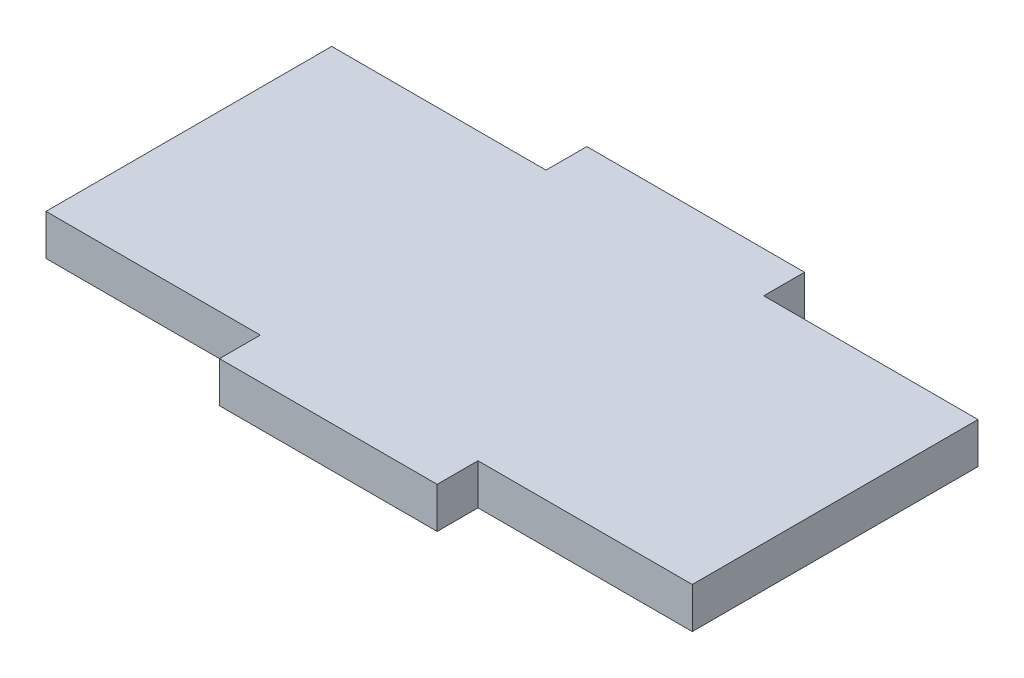
ISO-10303-21;
HEADER;
FILE_DESCRIPTION(('STEP AP214'),'2;1');
FILE_NAME('part.step','',(''),(''),'','','');
FILE_SCHEMA(('AUTOMOTIVE_DESIGN { 1 0 10303 214 1 1 1 1 }'));
ENDSEC;
DATA;
#1=APPLICATION_CONTEXT('core data for automotive mechanical design processes');
#2=APPLICATION_PROTOCOL_DEFINITION('international standard','automotive_design',2000,#1);
#3=PRODUCT_CONTEXT('',#1,'mechanical');
#4=PRODUCT('Part','Part','',(#3));
#5=PRODUCT_RELATED_PRODUCT_CATEGORY('part','',(#4));
#6=PRODUCT_DEFINITION_FORMATION('','',#4);
#7=PRODUCT_DEFINITION_CONTEXT('part definition',#1,'design');
#8=PRODUCT_DEFINITION('design','',#6,#7);
#9=PRODUCT_DEFINITION_SHAPE('','',#8);
#10=(LENGTH_UNIT() NAMED_UNIT(*) SI_UNIT(.MILLI.,.METRE.));
#11=(NAMED_UNIT(*) PLANE_ANGLE_UNIT() SI_UNIT($,.RADIAN.));
#12=(NAMED_UNIT(*) SI_UNIT($,.STERADIAN.) SOLID_ANGLE_UNIT());
#13=UNCERTAINTY_MEASURE_WITH_UNIT(LENGTH_MEASURE(1.E-05),#10,'distance_accuracy_value','');
#14=(GEOMETRIC_REPRESENTATION_CONTEXT(3) GLOBAL_UNCERTAINTY_ASSIGNED_CONTEXT((#13)) GLOBAL_UNIT_ASSIGNED_CONTEXT((#10,
#11,#12)) REPRESENTATION_CONTEXT('',''));
#15=CARTESIAN_POINT('',(0.,0.,0.));
#16=DIRECTION('',(0.,0.,1.));
#17=DIRECTION('',(1.,0.,0.));
#18=AXIS2_PLACEMENT_3D('',#15,#16,#17);
#19=CARTESIAN_POINT('',(-31.75,3.,0.));
#20=DIRECTION('',(-1.,0.,0.));
#21=DIRECTION('',(0.,0.,1.));
#22=AXIS2_PLACEMENT_3D('',#19,#20,#21);
#23=PLANE('',#22);
#24=DIRECTION('',(0.,0.,-1.));
#25=VECTOR('',#24,1.);
#26=CARTESIAN_POINT('',(-31.75,0.,0.));
#27=LINE('',#26,#25);
#28=CARTESIAN_POINT('',(-31.75,0.,0.));
#29=VERTEX_POINT('',#28);
#30=CARTESIAN_POINT('',(-31.75,0.,-3.));
#31=VERTEX_POINT('',#30);
#32=EDGE_CURVE('E155',#29,#31,#27,.T.);
#33=ORIENTED_EDGE('',*,*,#32,.F.);
#34=DIRECTION('',(0.,-1.,0.));
#35=VECTOR('',#34,1.);
#36=CARTESIAN_POINT('',(-31.75,3.,0.));
#37=LINE('',#36,#35);
#38=CARTESIAN_POINT('',(-31.75,3.,0.));
#39=VERTEX_POINT('',#38);
#40=EDGE_CURVE('E11',#39,#29,#37,.T.);
#41=ORIENTED_EDGE('',*,*,#40,.F.);
#42=DIRECTION('',(0.,0.,-1.));
#43=VECTOR('',#42,1.);
#44=CARTESIAN_POINT('',(-31.75,3.,0.));
#45=LINE('',#44,#43);
#46=CARTESIAN_POINT('',(-31.75,3.,-3.));
#47=VERTEX_POINT('',#46);
#48=EDGE_CURVE('E182',#39,#47,#45,.T.);
#49=ORIENTED_EDGE('',*,*,#48,.T.);
#50=DIRECTION('',(0.,-1.,0.));
#51=VECTOR('',#50,1.);
#52=CARTESIAN_POINT('',(-31.75,3.,-3.));
#53=LINE('',#52,#51);
#54=EDGE_CURVE('E53',#47,#31,#53,.T.);
#55=ORIENTED_EDGE('',*,*,#54,.T.);
#56=EDGE_LOOP('',(#33,#41,#49,#55));
#57=FACE_BOUND('',#56,.T.);
#58=ADVANCED_FACE('F37',(#57),#23,.T.);
#59=CARTESIAN_POINT('',(0.,3.,0.));
#60=DIRECTION('',(0.,0.,-1.));
#61=DIRECTION('',(-1.,0.,0.));
#62=AXIS2_PLACEMENT_3D('',#59,#60,#61);
#63=PLANE('',#62);
#64=DIRECTION('',(1.,0.,0.));
#65=VECTOR('',#64,1.);
#66=CARTESIAN_POINT('',(0.,0.,0.));
#67=LINE('',#66,#65);
#68=CARTESIAN_POINT('',(-15.75,0.,0.));
#69=VERTEX_POINT('',#68);
#70=EDGE_CURVE('E157',#29,#69,#67,.T.);
#71=ORIENTED_EDGE('',*,*,#70,.T.);
#72=DIRECTION('',(0.,-1.,0.));
#73=VECTOR('',#72,1.);
#74=CARTESIAN_POINT('',(-15.75,3.,0.));
#75=LINE('',#74,#73);
#76=CARTESIAN_POINT('',(-15.75,3.,0.));
#77=VERTEX_POINT('',#76);
#78=EDGE_CURVE('E45',#77,#69,#75,.T.);
#79=ORIENTED_EDGE('',*,*,#78,.F.);
#80=DIRECTION('',(1.,0.,0.));
#81=VECTOR('',#80,1.);
#82=CARTESIAN_POINT('',(0.,3.,0.));
#83=LINE('',#82,#81);
#84=EDGE_CURVE('E369',#39,#77,#83,.T.);
#85=ORIENTED_EDGE('',*,*,#84,.F.);
#86=ORIENTED_EDGE('',*,*,#40,.T.);
#87=EDGE_LOOP('',(#71,#79,#85,#86));
#88=FACE_BOUND('',#87,.T.);
#89=ADVANCED_FACE('F256',(#88),#63,.F.);
#90=CARTESIAN_POINT('',(-15.75,3.,0.));
#91=DIRECTION('',(-1.,0.,0.));
#92=DIRECTION('',(0.,0.,1.));
#93=AXIS2_PLACEMENT_3D('',#90,#91,#92);
#94=PLANE('',#93);
#95=DIRECTION('',(0.,0.,-1.));
#96=VECTOR('',#95,1.);
#97=CARTESIAN_POINT('',(-15.75,0.,0.));
#98=LINE('',#97,#96);
#99=CARTESIAN_POINT('',(-15.75,0.,-3.));
#100=VERTEX_POINT('',#99);
#101=EDGE_CURVE('E159',#69,#100,#98,.T.);
#102=ORIENTED_EDGE('',*,*,#101,.T.);
#103=DIRECTION('',(0.,-1.,0.));
#104=VECTOR('',#103,1.);
#105=CARTESIAN_POINT('',(-15.75,3.,-3.));
#106=LINE('',#105,#104);
#107=CARTESIAN_POINT('',(-15.75,3.,-3.));
#108=VERTEX_POINT('',#107);
#109=EDGE_CURVE('E198',#108,#100,#106,.T.);
#110=ORIENTED_EDGE('',*,*,#109,.F.);
#111=DIRECTION('',(0.,0.,-1.));
#112=VECTOR('',#111,1.);
#113=CARTESIAN_POINT('',(-15.75,3.,0.));
#114=LINE('',#113,#112);
#115=EDGE_CURVE('E207',#77,#108,#114,.T.);
#116=ORIENTED_EDGE('',*,*,#115,.F.);
#117=ORIENTED_EDGE('',*,*,#78,.T.);
#118=EDGE_LOOP('',(#102,#110,#116,#117));
#119=FACE_BOUND('',#118,.T.);
#120=ADVANCED_FACE('F205',(#119),#94,.F.);
#121=CARTESIAN_POINT('',(0.,3.,-3.));
#122=DIRECTION('',(0.,0.,-1.));
#123=DIRECTION('',(-1.,0.,0.));
#124=AXIS2_PLACEMENT_3D('',#121,#122,#123);
#125=PLANE('',#124);
#126=DIRECTION('',(1.,0.,0.));
#127=VECTOR('',#126,1.);
#128=CARTESIAN_POINT('',(0.,0.,-3.));
#129=LINE('',#128,#127);
#130=CARTESIAN_POINT('',(0.,0.,-3.));
#131=VERTEX_POINT('',#130);
#132=EDGE_CURVE('E161',#100,#131,#129,.T.);
#133=ORIENTED_EDGE('',*,*,#132,.T.);
#134=DIRECTION('',(0.,-1.,0.));
#135=VECTOR('',#134,1.);
#136=CARTESIAN_POINT('',(0.,3.,-3.));
#137=LINE('',#136,#135);
#138=CARTESIAN_POINT('',(0.,3.,-3.));
#139=VERTEX_POINT('',#138);
#140=EDGE_CURVE('E195',#139,#131,#137,.T.);
#141=ORIENTED_EDGE('',*,*,#140,.F.);
#142=DIRECTION('',(1.,0.,0.));
#143=VECTOR('',#142,1.);
#144=CARTESIAN_POINT('',(0.,3.,-3.));
#145=LINE('',#144,#143);
#146=EDGE_CURVE('E226',#108,#139,#145,.T.);
#147=ORIENTED_EDGE('',*,*,#146,.F.);
#148=ORIENTED_EDGE('',*,*,#109,.T.);
#149=EDGE_LOOP('',(#133,#141,#147,#148));
#150=FACE_BOUND('',#149,.T.);
#151=ADVANCED_FACE('F216',(#150),#125,.F.);
#152=CARTESIAN_POINT('',(0.,3.,0.));
#153=DIRECTION('',(-1.,0.,0.));
#154=DIRECTION('',(0.,0.,1.));
#155=AXIS2_PLACEMENT_3D('',#152,#153,#154);
#156=PLANE('',#155);
#157=DIRECTION('',(0.,0.,-1.));
#158=VECTOR('',#157,1.);
#159=CARTESIAN_POINT('',(0.,0.,0.));
#160=LINE('',#159,#158);
#161=CARTESIAN_POINT('',(0.,0.,-24.));
#162=VERTEX_POINT('',#161);
#163=EDGE_CURVE('E163',#131,#162,#160,.T.);
#164=ORIENTED_EDGE('',*,*,#163,.T.);
#165=DIRECTION('',(0.,-1.,0.));
#166=VECTOR('',#165,1.);
#167=CARTESIAN_POINT('',(0.,3.,-24.));
#168=LINE('',#167,#166);
#169=CARTESIAN_POINT('',(0.,3.,-24.));
#170=VERTEX_POINT('',#169);
#171=EDGE_CURVE('E193',#170,#162,#168,.T.);
#172=ORIENTED_EDGE('',*,*,#171,.F.);
#173=DIRECTION('',(0.,0.,-1.));
#174=VECTOR('',#173,1.);
#175=CARTESIAN_POINT('',(0.,3.,0.));
#176=LINE('',#175,#174);
#177=EDGE_CURVE('E222',#139,#170,#176,.T.);
#178=ORIENTED_EDGE('',*,*,#177,.F.);
#179=ORIENTED_EDGE('',*,*,#140,.T.);
#180=EDGE_LOOP('',(#164,#172,#178,#179));
#181=FACE_BOUND('',#180,.T.);
#182=ADVANCED_FACE('F220',(#181),#156,.F.);
#183=CARTESIAN_POINT('',(0.,3.,-24.));
#184=DIRECTION('',(0.,0.,-1.));
#185=DIRECTION('',(-1.,0.,0.));
#186=AXIS2_PLACEMENT_3D('',#183,#184,#185);
#187=PLANE('',#186);
#188=DIRECTION('',(1.,0.,0.));
#189=VECTOR('',#188,1.);
#190=CARTESIAN_POINT('',(0.,0.,-24.));
#191=LINE('',#190,#189);
#192=CARTESIAN_POINT('',(-15.75,0.,-24.));
#193=VERTEX_POINT('',#192);
#194=EDGE_CURVE('E166',#193,#162,#191,.T.);
#195=ORIENTED_EDGE('',*,*,#194,.F.);
#196=DIRECTION('',(0.,-1.,0.));
#197=VECTOR('',#196,1.);
#198=CARTESIAN_POINT('',(-15.75,3.,-24.));
#199=LINE('',#198,#197);
#200=CARTESIAN_POINT('',(-15.75,3.,-24.));
#201=VERTEX_POINT('',#200);
#202=EDGE_CURVE('E191',#201,#193,#199,.T.);
#203=ORIENTED_EDGE('',*,*,#202,.F.);
#204=DIRECTION('',(1.,0.,0.));
#205=VECTOR('',#204,1.);
#206=CARTESIAN_POINT('',(0.,3.,-24.));
#207=LINE('',#206,#205);
#208=EDGE_CURVE('E225',#201,#170,#207,.T.);
#209=ORIENTED_EDGE('',*,*,#208,.T.);
#210=ORIENTED_EDGE('',*,*,#171,.T.);
#211=EDGE_LOOP('',(#195,#203,#209,#210));
#212=FACE_BOUND('',#211,.T.);
#213=ADVANCED_FACE('F269',(#212),#187,.T.);
#214=CARTESIAN_POINT('',(-15.75,3.,0.));
#215=DIRECTION('',(1.,0.,0.));
#216=DIRECTION('',(0.,0.,-1.));
#217=AXIS2_PLACEMENT_3D('',#214,#215,#216);
#218=PLANE('',#217);
#219=DIRECTION('',(0.,0.,1.));
#220=VECTOR('',#219,1.);
#221=CARTESIAN_POINT('',(-15.75,0.,0.));
#222=LINE('',#221,#220);
#223=CARTESIAN_POINT('',(-15.75,0.,-27.));
#224=VERTEX_POINT('',#223);
#225=EDGE_CURVE('E169',#224,#193,#222,.T.);
#226=ORIENTED_EDGE('',*,*,#225,.F.);
#227=DIRECTION('',(0.,-1.,0.));
#228=VECTOR('',#227,1.);
#229=CARTESIAN_POINT('',(-15.75,3.,-27.));
#230=LINE('',#229,#228);
#231=CARTESIAN_POINT('',(-15.75,3.,-27.));
#232=VERTEX_POINT('',#231);
#233=EDGE_CURVE('E189',#232,#224,#230,.T.);
#234=ORIENTED_EDGE('',*,*,#233,.F.);
#235=DIRECTION('',(0.,0.,1.));
#236=VECTOR('',#235,1.);
#237=CARTESIAN_POINT('',(-15.75,3.,0.));
#238=LINE('',#237,#236);
#239=EDGE_CURVE('E228',#232,#201,#238,.T.);
#240=ORIENTED_EDGE('',*,*,#239,.T.);
#241=ORIENTED_EDGE('',*,*,#202,.T.);
#242=EDGE_LOOP('',(#226,#234,#240,#241));
#243=FACE_BOUND('',#242,.T.);
#244=ADVANCED_FACE('F272',(#243),#218,.T.);
#245=CARTESIAN_POINT('',(0.,3.,-27.));
#246=DIRECTION('',(0.,0.,1.));
#247=DIRECTION('',(1.,0.,0.));
#248=AXIS2_PLACEMENT_3D('',#245,#246,#247);
#249=PLANE('',#248);
#250=DIRECTION('',(-1.,0.,0.));
#251=VECTOR('',#250,1.);
#252=CARTESIAN_POINT('',(0.,0.,-27.));
#253=LINE('',#252,#251);
#254=CARTESIAN_POINT('',(-31.75,0.,-27.));
#255=VERTEX_POINT('',#254);
#256=EDGE_CURVE('E172',#224,#255,#253,.T.);
#257=ORIENTED_EDGE('',*,*,#256,.T.);
#258=DIRECTION('',(0.,-1.,0.));
#259=VECTOR('',#258,1.);
#260=CARTESIAN_POINT('',(-31.75,3.,-27.));
#261=LINE('',#260,#259);
#262=CARTESIAN_POINT('',(-31.75,3.,-27.));
#263=VERTEX_POINT('',#262);
#264=EDGE_CURVE('E186',#263,#255,#261,.T.);
#265=ORIENTED_EDGE('',*,*,#264,.F.);
#266=DIRECTION('',(-1.,0.,0.));
#267=VECTOR('',#266,1.);
#268=CARTESIAN_POINT('',(0.,3.,-27.));
#269=LINE('',#268,#267);
#270=EDGE_CURVE('E235',#232,#263,#269,.T.);
#271=ORIENTED_EDGE('',*,*,#270,.F.);
#272=ORIENTED_EDGE('',*,*,#233,.T.);
#273=EDGE_LOOP('',(#257,#265,#271,#272));
#274=FACE_BOUND('',#273,.T.);
#275=ADVANCED_FACE('F240',(#274),#249,.F.);
#276=CARTESIAN_POINT('',(-31.75,3.,0.));
#277=DIRECTION('',(1.,0.,0.));
#278=DIRECTION('',(0.,0.,-1.));
#279=AXIS2_PLACEMENT_3D('',#276,#277,#278);
#280=PLANE('',#279);
#281=DIRECTION('',(0.,0.,1.));
#282=VECTOR('',#281,1.);
#283=CARTESIAN_POINT('',(-31.75,0.,0.));
#284=LINE('',#283,#282);
#285=CARTESIAN_POINT('',(-31.75,0.,-24.));
#286=VERTEX_POINT('',#285);
#287=EDGE_CURVE('E174',#255,#286,#284,.T.);
#288=ORIENTED_EDGE('',*,*,#287,.T.);
#289=DIRECTION('',(0.,-1.,0.));
#290=VECTOR('',#289,1.);
#291=CARTESIAN_POINT('',(-31.75,3.,-24.));
#292=LINE('',#291,#290);
#293=CARTESIAN_POINT('',(-31.75,3.,-24.));
#294=VERTEX_POINT('',#293);
#295=EDGE_CURVE('E147',#294,#286,#292,.T.);
#296=ORIENTED_EDGE('',*,*,#295,.F.);
#297=DIRECTION('',(0.,0.,1.));
#298=VECTOR('',#297,1.);
#299=CARTESIAN_POINT('',(-31.75,3.,0.));
#300=LINE('',#299,#298);
#301=EDGE_CURVE('E135',#263,#294,#300,.T.);
#302=ORIENTED_EDGE('',*,*,#301,.F.);
#303=ORIENTED_EDGE('',*,*,#264,.T.);
#304=EDGE_LOOP('',(#288,#296,#302,#303));
#305=FACE_BOUND('',#304,.T.);
#306=ADVANCED_FACE('F244',(#305),#280,.F.);
#307=CARTESIAN_POINT('',(0.,3.,-24.));
#308=DIRECTION('',(0.,0.,1.));
#309=DIRECTION('',(1.,0.,0.));
#310=AXIS2_PLACEMENT_3D('',#307,#308,#309);
#311=PLANE('',#310);
#312=DIRECTION('',(-1.,0.,0.));
#313=VECTOR('',#312,1.);
#314=CARTESIAN_POINT('',(0.,0.,-24.));
#315=LINE('',#314,#313);
#316=CARTESIAN_POINT('',(-47.5,0.,-24.));
#317=VERTEX_POINT('',#316);
#318=EDGE_CURVE('E144',#286,#317,#315,.T.);
#319=ORIENTED_EDGE('',*,*,#318,.T.);
#320=DIRECTION('',(0.,-1.,0.));
#321=VECTOR('',#320,1.);
#322=CARTESIAN_POINT('',(-47.5,3.,-24.));
#323=LINE('',#322,#321);
#324=CARTESIAN_POINT('',(-47.5,3.,-24.));
#325=VERTEX_POINT('',#324);
#326=EDGE_CURVE('E141',#325,#317,#323,.T.);
#327=ORIENTED_EDGE('',*,*,#326,.F.);
#328=DIRECTION('',(-1.,0.,0.));
#329=VECTOR('',#328,1.);
#330=CARTESIAN_POINT('',(0.,3.,-24.));
#331=LINE('',#330,#329);
#332=EDGE_CURVE('E127',#294,#325,#331,.T.);
#333=ORIENTED_EDGE('',*,*,#332,.F.);
#334=ORIENTED_EDGE('',*,*,#295,.T.);
#335=EDGE_LOOP('',(#319,#327,#333,#334));
#336=FACE_BOUND('',#335,.T.);
#337=ADVANCED_FACE('F142',(#336),#311,.F.);
#338=CARTESIAN_POINT('',(-47.5,3.,0.));
#339=DIRECTION('',(-1.,0.,0.));
#340=DIRECTION('',(0.,0.,1.));
#341=AXIS2_PLACEMENT_3D('',#338,#339,#340);
#342=PLANE('',#341);
#343=DIRECTION('',(0.,0.,-1.));
#344=VECTOR('',#343,1.);
#345=CARTESIAN_POINT('',(-47.5,0.,0.));
#346=LINE('',#345,#344);
#347=CARTESIAN_POINT('',(-47.5,0.,-3.));
#348=VERTEX_POINT('',#347);
#349=EDGE_CURVE('E177',#348,#317,#346,.T.);
#350=ORIENTED_EDGE('',*,*,#349,.F.);
#351=DIRECTION('',(0.,-1.,0.));
#352=VECTOR('',#351,1.);
#353=CARTESIAN_POINT('',(-47.5,3.,-3.));
#354=LINE('',#353,#352);
#355=CARTESIAN_POINT('',(-47.5,3.,-3.));
#356=VERTEX_POINT('',#355);
#357=EDGE_CURVE('E90',#356,#348,#354,.T.);
#358=ORIENTED_EDGE('',*,*,#357,.F.);
#359=DIRECTION('',(0.,0.,-1.));
#360=VECTOR('',#359,1.);
#361=CARTESIAN_POINT('',(-47.5,3.,0.));
#362=LINE('',#361,#360);
#363=EDGE_CURVE('E133',#356,#325,#362,.T.);
#364=ORIENTED_EDGE('',*,*,#363,.T.);
#365=ORIENTED_EDGE('',*,*,#326,.T.);
#366=EDGE_LOOP('',(#350,#358,#364,#365));
#367=FACE_BOUND('',#366,.T.);
#368=ADVANCED_FACE('F149',(#367),#342,.T.);
#369=CARTESIAN_POINT('',(0.,3.,-3.));
#370=DIRECTION('',(0.,0.,1.));
#371=DIRECTION('',(1.,0.,0.));
#372=AXIS2_PLACEMENT_3D('',#369,#370,#371);
#373=PLANE('',#372);
#374=DIRECTION('',(-1.,0.,0.));
#375=VECTOR('',#374,1.);
#376=CARTESIAN_POINT('',(0.,0.,-3.));
#377=LINE('',#376,#375);
#378=EDGE_CURVE('E179',#31,#348,#377,.T.);
#379=ORIENTED_EDGE('',*,*,#378,.F.);
#380=ORIENTED_EDGE('',*,*,#54,.F.);
#381=DIRECTION('',(-1.,0.,0.));
#382=VECTOR('',#381,1.);
#383=CARTESIAN_POINT('',(0.,3.,-3.));
#384=LINE('',#383,#382);
#385=EDGE_CURVE('E150',#47,#356,#384,.T.);
#386=ORIENTED_EDGE('',*,*,#385,.T.);
#387=ORIENTED_EDGE('',*,*,#357,.T.);
#388=EDGE_LOOP('',(#379,#380,#386,#387));
#389=FACE_BOUND('',#388,.T.);
#390=ADVANCED_FACE('F245',(#389),#373,.T.);
#391=CARTESIAN_POINT('',(0.,3.,0.));
#392=DIRECTION('',(0.,1.,0.));
#393=DIRECTION('',(0.,0.,1.));
#394=AXIS2_PLACEMENT_3D('',#391,#392,#393);
#395=PLANE('',#394);
#396=ORIENTED_EDGE('',*,*,#48,.F.);
#397=ORIENTED_EDGE('',*,*,#84,.T.);
#398=ORIENTED_EDGE('',*,*,#115,.T.);
#399=ORIENTED_EDGE('',*,*,#146,.T.);
#400=ORIENTED_EDGE('',*,*,#177,.T.);
#401=ORIENTED_EDGE('',*,*,#208,.F.);
#402=ORIENTED_EDGE('',*,*,#239,.F.);
#403=ORIENTED_EDGE('',*,*,#270,.T.);
#404=ORIENTED_EDGE('',*,*,#301,.T.);
#405=ORIENTED_EDGE('',*,*,#332,.T.);
#406=ORIENTED_EDGE('',*,*,#363,.F.);
#407=ORIENTED_EDGE('',*,*,#385,.F.);
#408=EDGE_LOOP('',(#396,#397,#398,#399,#400,#401,#402,#403,#404,#405,#406,#407));
#409=FACE_BOUND('',#408,.T.);
#410=ADVANCED_FACE('F130',(#409),#395,.T.);
#411=CARTESIAN_POINT('',(0.,0.,0.));
#412=DIRECTION('',(0.,1.,0.));
#413=DIRECTION('',(0.,0.,1.));
#414=AXIS2_PLACEMENT_3D('',#411,#412,#413);
#415=PLANE('',#414);
#416=ORIENTED_EDGE('',*,*,#32,.T.);
#417=ORIENTED_EDGE('',*,*,#378,.T.);
#418=ORIENTED_EDGE('',*,*,#349,.T.);
#419=ORIENTED_EDGE('',*,*,#318,.F.);
#420=ORIENTED_EDGE('',*,*,#287,.F.);
#421=ORIENTED_EDGE('',*,*,#256,.F.);
#422=ORIENTED_EDGE('',*,*,#225,.T.);
#423=ORIENTED_EDGE('',*,*,#194,.T.);
#424=ORIENTED_EDGE('',*,*,#163,.F.);
#425=ORIENTED_EDGE('',*,*,#132,.F.);
#426=ORIENTED_EDGE('',*,*,#101,.F.);
#427=ORIENTED_EDGE('',*,*,#70,.F.);
#428=EDGE_LOOP('',(#416,#417,#418,#419,#420,#421,#422,#423,#424,#425,#426,#427));
#429=FACE_BOUND('',#428,.T.);
#430=ADVANCED_FACE('F212',(#429),#415,.F.);
#431=CLOSED_SHELL('',(#58,#89,#120,#151,#182,#213,#244,#275,#306,#337,#368,#390,#410,#430));
#432=MANIFOLD_SOLID_BREP('B2',#431);
#433=ADVANCED_BREP_SHAPE_REPRESENTATION('',(#18,#432),#14);
#434=SHAPE_DEFINITION_REPRESENTATION(#9,#433);
ENDSEC;
END-ISO-10303-21;
